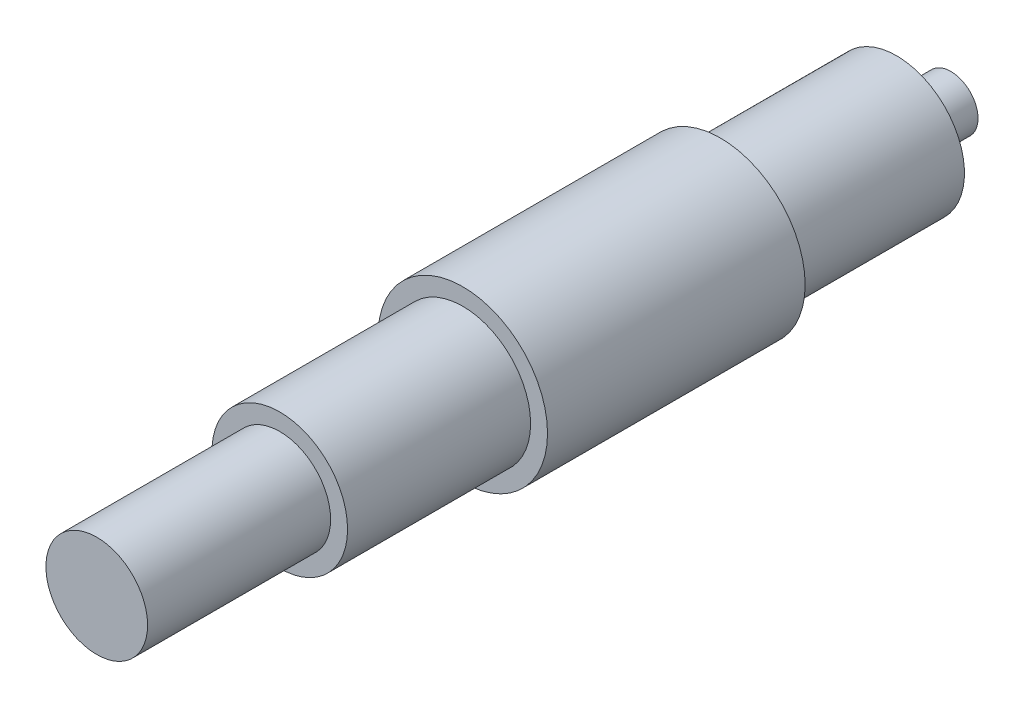
ISO-10303-21;
HEADER;
FILE_DESCRIPTION(('STEP AP214'),'2;1');
FILE_NAME('part.step','',(''),(''),'','','');
FILE_SCHEMA(('AUTOMOTIVE_DESIGN { 1 0 10303 214 1 1 1 1 }'));
ENDSEC;
DATA;
#1=APPLICATION_CONTEXT('core data for automotive mechanical design processes');
#2=APPLICATION_PROTOCOL_DEFINITION('international standard','automotive_design',2000,#1);
#3=PRODUCT_CONTEXT('',#1,'mechanical');
#4=PRODUCT('Part','Part','',(#3));
#5=PRODUCT_RELATED_PRODUCT_CATEGORY('part','',(#4));
#6=PRODUCT_DEFINITION_FORMATION('','',#4);
#7=PRODUCT_DEFINITION_CONTEXT('part definition',#1,'design');
#8=PRODUCT_DEFINITION('design','',#6,#7);
#9=PRODUCT_DEFINITION_SHAPE('','',#8);
#10=(LENGTH_UNIT() NAMED_UNIT(*) SI_UNIT(.MILLI.,.METRE.));
#11=(NAMED_UNIT(*) PLANE_ANGLE_UNIT() SI_UNIT($,.RADIAN.));
#12=(NAMED_UNIT(*) SI_UNIT($,.STERADIAN.) SOLID_ANGLE_UNIT());
#13=UNCERTAINTY_MEASURE_WITH_UNIT(LENGTH_MEASURE(1.E-05),#10,'distance_accuracy_value','');
#14=(GEOMETRIC_REPRESENTATION_CONTEXT(3) GLOBAL_UNCERTAINTY_ASSIGNED_CONTEXT((#13)) GLOBAL_UNIT_ASSIGNED_CONTEXT((#10,
#11,#12)) REPRESENTATION_CONTEXT('',''));
#15=CARTESIAN_POINT('',(0.,0.,0.));
#16=DIRECTION('',(0.,0.,1.));
#17=DIRECTION('',(1.,0.,0.));
#18=AXIS2_PLACEMENT_3D('',#15,#16,#17);
#19=CARTESIAN_POINT('',(0.,0.,8.));
#20=DIRECTION('',(0.,0.,-1.));
#21=DIRECTION('',(-1.,0.,0.));
#22=AXIS2_PLACEMENT_3D('',#19,#20,#21);
#23=CYLINDRICAL_SURFACE('',#22,4.);
#24=CARTESIAN_POINT('',(0.,0.,8.));
#25=DIRECTION('',(0.,0.,1.));
#26=DIRECTION('',(1.,0.,0.));
#27=AXIS2_PLACEMENT_3D('',#24,#25,#26);
#28=CIRCLE('',#27,4.);
#29=CARTESIAN_POINT('',(4.,0.,8.));
#30=VERTEX_POINT('',#29);
#31=EDGE_CURVE('E45',#30,#30,#28,.T.);
#32=ORIENTED_EDGE('',*,*,#31,.F.);
#33=EDGE_LOOP('',(#32));
#34=FACE_BOUND('',#33,.T.);
#35=CARTESIAN_POINT('',(0.,0.,0.));
#36=DIRECTION('',(0.,0.,1.));
#37=DIRECTION('',(1.,0.,0.));
#38=AXIS2_PLACEMENT_3D('',#35,#36,#37);
#39=CIRCLE('',#38,4.);
#40=CARTESIAN_POINT('',(4.,0.,0.));
#41=VERTEX_POINT('',#40);
#42=EDGE_CURVE('E41',#41,#41,#39,.T.);
#43=ORIENTED_EDGE('',*,*,#42,.T.);
#44=EDGE_LOOP('',(#43));
#45=FACE_BOUND('',#44,.T.);
#46=ADVANCED_FACE('F38',(#34,#45),#23,.T.);
#47=CARTESIAN_POINT('',(0.,0.,0.));
#48=DIRECTION('',(0.,0.,1.));
#49=DIRECTION('',(1.,0.,0.));
#50=AXIS2_PLACEMENT_3D('',#47,#48,#49);
#51=PLANE('',#50);
#52=ORIENTED_EDGE('',*,*,#42,.F.);
#53=EDGE_LOOP('',(#52));
#54=FACE_BOUND('',#53,.T.);
#55=ADVANCED_FACE('F81',(#54),#51,.F.);
#56=CARTESIAN_POINT('',(0.,0.,34.));
#57=DIRECTION('',(0.,0.,-1.));
#58=DIRECTION('',(-1.,0.,0.));
#59=AXIS2_PLACEMENT_3D('',#56,#57,#58);
#60=CYLINDRICAL_SURFACE('',#59,10.);
#61=CARTESIAN_POINT('',(0.,0.,34.));
#62=DIRECTION('',(0.,0.,1.));
#63=DIRECTION('',(1.,0.,0.));
#64=AXIS2_PLACEMENT_3D('',#61,#62,#63);
#65=CIRCLE('',#64,10.);
#66=CARTESIAN_POINT('',(-10.,0.,34.));
#67=VERTEX_POINT('',#66);
#68=EDGE_CURVE('E61',#67,#67,#65,.T.);
#69=CARTESIAN_POINT('',(0.,0.,8.));
#70=DIRECTION('',(0.,0.,1.));
#71=DIRECTION('',(1.,0.,0.));
#72=AXIS2_PLACEMENT_3D('',#69,#70,#71);
#73=CIRCLE('',#72,10.);
#74=CARTESIAN_POINT('',(-10.,0.,8.));
#75=VERTEX_POINT('',#74);
#76=EDGE_CURVE('E57',#75,#75,#73,.T.);
#77=CARTESIAN_POINT('',(-10.,0.,34.));
#78=CARTESIAN_POINT('',(-10.,0.,33.7291666666667));
#79=CARTESIAN_POINT('',(-10.,0.,33.4583333333333));
#80=CARTESIAN_POINT('',(-10.,0.,32.9166666666667));
#81=CARTESIAN_POINT('',(-10.,0.,32.6458333333333));
#82=CARTESIAN_POINT('',(-10.,0.,32.1041666666667));
#83=CARTESIAN_POINT('',(-10.,0.,31.8333333333333));
#84=CARTESIAN_POINT('',(-10.,0.,31.2916666666667));
#85=CARTESIAN_POINT('',(-10.,0.,31.0208333333333));
#86=CARTESIAN_POINT('',(-10.,0.,30.4791666666667));
#87=CARTESIAN_POINT('',(-10.,0.,30.2083333333333));
#88=CARTESIAN_POINT('',(-10.,0.,29.6666666666667));
#89=CARTESIAN_POINT('',(-10.,0.,29.3958333333333));
#90=CARTESIAN_POINT('',(-10.,0.,28.8541666666667));
#91=CARTESIAN_POINT('',(-10.,0.,28.5833333333333));
#92=CARTESIAN_POINT('',(-10.,0.,28.0416666666667));
#93=CARTESIAN_POINT('',(-10.,0.,27.7708333333333));
#94=CARTESIAN_POINT('',(-10.,0.,27.2291666666667));
#95=CARTESIAN_POINT('',(-10.,0.,26.9583333333333));
#96=CARTESIAN_POINT('',(-10.,0.,26.4166666666667));
#97=CARTESIAN_POINT('',(-10.,0.,26.1458333333333));
#98=CARTESIAN_POINT('',(-10.,0.,25.6041666666667));
#99=CARTESIAN_POINT('',(-10.,0.,25.3333333333333));
#100=CARTESIAN_POINT('',(-10.,0.,24.7916666666667));
#101=CARTESIAN_POINT('',(-10.,0.,24.5208333333333));
#102=CARTESIAN_POINT('',(-10.,0.,23.9791666666667));
#103=CARTESIAN_POINT('',(-10.,0.,23.7083333333333));
#104=CARTESIAN_POINT('',(-10.,0.,23.1666666666667));
#105=CARTESIAN_POINT('',(-10.,0.,22.8958333333333));
#106=CARTESIAN_POINT('',(-10.,0.,22.3541666666667));
#107=CARTESIAN_POINT('',(-10.,0.,22.0833333333333));
#108=CARTESIAN_POINT('',(-10.,0.,21.5416666666667));
#109=CARTESIAN_POINT('',(-10.,0.,21.2708333333333));
#110=CARTESIAN_POINT('',(-10.,0.,20.7291666666667));
#111=CARTESIAN_POINT('',(-10.,0.,20.4583333333333));
#112=CARTESIAN_POINT('',(-10.,0.,19.9166666666667));
#113=CARTESIAN_POINT('',(-10.,0.,19.6458333333333));
#114=CARTESIAN_POINT('',(-10.,0.,19.1041666666667));
#115=CARTESIAN_POINT('',(-10.,0.,18.8333333333333));
#116=CARTESIAN_POINT('',(-10.,0.,18.2916666666667));
#117=CARTESIAN_POINT('',(-10.,0.,18.0208333333333));
#118=CARTESIAN_POINT('',(-10.,0.,17.4791666666667));
#119=CARTESIAN_POINT('',(-10.,0.,17.2083333333333));
#120=CARTESIAN_POINT('',(-10.,0.,16.6666666666667));
#121=CARTESIAN_POINT('',(-10.,0.,16.3958333333333));
#122=CARTESIAN_POINT('',(-10.,0.,15.8541666666667));
#123=CARTESIAN_POINT('',(-10.,0.,15.5833333333333));
#124=CARTESIAN_POINT('',(-10.,0.,15.0416666666667));
#125=CARTESIAN_POINT('',(-10.,0.,14.7708333333333));
#126=CARTESIAN_POINT('',(-10.,0.,14.2291666666667));
#127=CARTESIAN_POINT('',(-10.,0.,13.9583333333333));
#128=CARTESIAN_POINT('',(-10.,0.,13.4166666666667));
#129=CARTESIAN_POINT('',(-10.,0.,13.1458333333333));
#130=CARTESIAN_POINT('',(-10.,0.,12.6041666666667));
#131=CARTESIAN_POINT('',(-10.,0.,12.3333333333333));
#132=CARTESIAN_POINT('',(-10.,0.,11.7916666666667));
#133=CARTESIAN_POINT('',(-10.,0.,11.5208333333333));
#134=CARTESIAN_POINT('',(-10.,0.,10.9791666666667));
#135=CARTESIAN_POINT('',(-10.,0.,10.7083333333333));
#136=CARTESIAN_POINT('',(-10.,0.,10.1666666666667));
#137=CARTESIAN_POINT('',(-10.,0.,9.89583333333333));
#138=CARTESIAN_POINT('',(-10.,0.,9.35416666666666));
#139=CARTESIAN_POINT('',(-10.,0.,9.08333333333333));
#140=CARTESIAN_POINT('',(-10.,0.,8.54166666666666));
#141=CARTESIAN_POINT('',(-10.,0.,8.27083333333333));
#142=CARTESIAN_POINT('',(-10.,0.,8.));
#143=B_SPLINE_CURVE_WITH_KNOTS('',3,(#77,#78,#79,#80,#81,#82,#83,#84,#85,#86,#87,#88,#89,#90,
#91,#92,#93,#94,#95,#96,#97,#98,#99,#100,#101,#102,#103,#104,#105,#106,#107,#108,#109,#110,#111,
#112,#113,#114,#115,#116,#117,#118,#119,#120,#121,#122,#123,#124,#125,#126,#127,#128,#129,#130,
#131,#132,#133,#134,#135,#136,#137,#138,#139,#140,#141,#142),.UNSPECIFIED.,.F.,.F.,(4,2,2,2,2,2,
2,2,2,2,2,2,2,2,2,2,2,2,2,2,2,2,2,2,2,2,2,2,2,2,2,2,4),(0.,0.812500000000001,1.625,2.4375,3.25,
4.0625,4.875,5.68750000000001,6.50000000000001,7.3125,8.125,8.93750000000001,9.75,10.5625,
11.375,12.1875,13.,13.8125,14.625,15.4375,16.25,17.0625,17.875,18.6875,19.5,20.3125,21.125,
21.9375,22.75,23.5625,24.375,25.1875,26.),.UNSPECIFIED.);
#144=EDGE_CURVE('BSEAM67',#67,#75,#143,.T.);
#145=ORIENTED_EDGE('',*,*,#68,.F.);
#146=ORIENTED_EDGE('',*,*,#76,.T.);
#147=ORIENTED_EDGE('',*,*,#144,.T.);
#148=ORIENTED_EDGE('',*,*,#144,.F.);
#149=EDGE_LOOP('',(#145,#147,#146,#148));
#150=FACE_BOUND('',#149,.T.);
#151=ADVANCED_FACE('F67',(#150),#60,.T.);
#152=CARTESIAN_POINT('',(0.,0.,8.));
#153=DIRECTION('',(0.,0.,1.));
#154=DIRECTION('',(1.,0.,0.));
#155=AXIS2_PLACEMENT_3D('',#152,#153,#154);
#156=PLANE('',#155);
#157=ORIENTED_EDGE('',*,*,#31,.T.);
#158=EDGE_LOOP('',(#157));
#159=FACE_BOUND('',#158,.T.);
#160=ORIENTED_EDGE('',*,*,#76,.F.);
#161=EDGE_LOOP('',(#160));
#162=FACE_BOUND('',#161,.T.);
#163=ADVANCED_FACE('F69',(#159,#162),#156,.F.);
#164=CARTESIAN_POINT('',(0.,0.,72.));
#165=DIRECTION('',(0.,0.,-1.));
#166=DIRECTION('',(-1.,0.,0.));
#167=AXIS2_PLACEMENT_3D('',#164,#165,#166);
#168=CYLINDRICAL_SURFACE('',#167,12.5);
#169=CARTESIAN_POINT('',(0.,0.,72.));
#170=DIRECTION('',(0.,0.,1.));
#171=DIRECTION('',(1.,0.,0.));
#172=AXIS2_PLACEMENT_3D('',#169,#170,#171);
#173=CIRCLE('',#172,12.5);
#174=CARTESIAN_POINT('',(12.5,0.,72.));
#175=VERTEX_POINT('',#174);
#176=EDGE_CURVE('E54',#175,#175,#173,.T.);
#177=ORIENTED_EDGE('',*,*,#176,.F.);
#178=EDGE_LOOP('',(#177));
#179=FACE_BOUND('',#178,.T.);
#180=CARTESIAN_POINT('',(0.,0.,34.));
#181=DIRECTION('',(0.,0.,1.));
#182=DIRECTION('',(1.,0.,0.));
#183=AXIS2_PLACEMENT_3D('',#180,#181,#182);
#184=CIRCLE('',#183,12.5);
#185=CARTESIAN_POINT('',(12.5,0.,34.));
#186=VERTEX_POINT('',#185);
#187=EDGE_CURVE('E58',#186,#186,#184,.T.);
#188=ORIENTED_EDGE('',*,*,#187,.T.);
#189=EDGE_LOOP('',(#188));
#190=FACE_BOUND('',#189,.T.);
#191=ADVANCED_FACE('F71',(#179,#190),#168,.T.);
#192=CARTESIAN_POINT('',(0.,0.,72.));
#193=DIRECTION('',(0.,0.,1.));
#194=DIRECTION('',(1.,0.,0.));
#195=AXIS2_PLACEMENT_3D('',#192,#193,#194);
#196=PLANE('',#195);
#197=CARTESIAN_POINT('',(0.,0.,72.));
#198=DIRECTION('',(0.,0.,1.));
#199=DIRECTION('',(1.,0.,0.));
#200=AXIS2_PLACEMENT_3D('',#197,#198,#199);
#201=CIRCLE('',#200,10.);
#202=CARTESIAN_POINT('',(10.,0.,72.));
#203=VERTEX_POINT('',#202);
#204=EDGE_CURVE('E10',#203,#203,#201,.T.);
#205=ORIENTED_EDGE('',*,*,#204,.F.);
#206=EDGE_LOOP('',(#205));
#207=FACE_BOUND('',#206,.T.);
#208=ORIENTED_EDGE('',*,*,#176,.T.);
#209=EDGE_LOOP('',(#208));
#210=FACE_BOUND('',#209,.T.);
#211=ADVANCED_FACE('F78',(#207,#210),#196,.T.);
#212=CARTESIAN_POINT('',(0.,0.,34.));
#213=DIRECTION('',(0.,0.,1.));
#214=DIRECTION('',(1.,0.,0.));
#215=AXIS2_PLACEMENT_3D('',#212,#213,#214);
#216=PLANE('',#215);
#217=ORIENTED_EDGE('',*,*,#68,.T.);
#218=EDGE_LOOP('',(#217));
#219=FACE_BOUND('',#218,.T.);
#220=ORIENTED_EDGE('',*,*,#187,.F.);
#221=EDGE_LOOP('',(#220));
#222=FACE_BOUND('',#221,.T.);
#223=ADVANCED_FACE('F120',(#219,#222),#216,.F.);
#224=CARTESIAN_POINT('',(0.,0.,92.));
#225=DIRECTION('',(0.,0.,-1.));
#226=DIRECTION('',(-1.,0.,0.));
#227=AXIS2_PLACEMENT_3D('',#224,#225,#226);
#228=CYLINDRICAL_SURFACE('',#227,10.);
#229=ORIENTED_EDGE('',*,*,#204,.T.);
#230=EDGE_LOOP('',(#229));
#231=FACE_BOUND('',#230,.T.);
#232=CARTESIAN_POINT('',(0.,0.,99.));
#233=DIRECTION('',(0.,0.,1.));
#234=DIRECTION('',(1.,0.,0.));
#235=AXIS2_PLACEMENT_3D('',#232,#233,#234);
#236=CIRCLE('',#235,10.);
#237=CARTESIAN_POINT('',(10.,0.,99.));
#238=VERTEX_POINT('',#237);
#239=EDGE_CURVE('E209',#238,#238,#236,.T.);
#240=ORIENTED_EDGE('',*,*,#239,.F.);
#241=EDGE_LOOP('',(#240));
#242=FACE_BOUND('',#241,.T.);
#243=ADVANCED_FACE('F125',(#231,#242),#228,.T.);
#244=CARTESIAN_POINT('',(0.,0.,99.));
#245=DIRECTION('',(0.,0.,1.));
#246=DIRECTION('',(1.,0.,0.));
#247=AXIS2_PLACEMENT_3D('',#244,#245,#246);
#248=PLANE('',#247);
#249=ORIENTED_EDGE('',*,*,#239,.T.);
#250=EDGE_LOOP('',(#249));
#251=FACE_BOUND('',#250,.T.);
#252=CARTESIAN_POINT('',(0.,0.,99.));
#253=DIRECTION('',(0.,0.,1.));
#254=DIRECTION('',(1.,0.,0.));
#255=AXIS2_PLACEMENT_3D('',#252,#253,#254);
#256=CIRCLE('',#255,7.5);
#257=CARTESIAN_POINT('',(7.5,0.,99.));
#258=VERTEX_POINT('',#257);
#259=EDGE_CURVE('E206',#258,#258,#256,.T.);
#260=ORIENTED_EDGE('',*,*,#259,.F.);
#261=EDGE_LOOP('',(#260));
#262=FACE_BOUND('',#261,.T.);
#263=ADVANCED_FACE('F148',(#251,#262),#248,.T.);
#264=CARTESIAN_POINT('',(0.,0.,126.));
#265=DIRECTION('',(0.,0.,1.));
#266=DIRECTION('',(1.,0.,0.));
#267=AXIS2_PLACEMENT_3D('',#264,#265,#266);
#268=PLANE('',#267);
#269=CARTESIAN_POINT('',(0.,0.,126.));
#270=DIRECTION('',(0.,0.,1.));
#271=DIRECTION('',(1.,0.,0.));
#272=AXIS2_PLACEMENT_3D('',#269,#270,#271);
#273=CIRCLE('',#272,7.5);
#274=CARTESIAN_POINT('',(7.5,0.,126.));
#275=VERTEX_POINT('',#274);
#276=EDGE_CURVE('E52',#275,#275,#273,.T.);
#277=ORIENTED_EDGE('',*,*,#276,.T.);
#278=EDGE_LOOP('',(#277));
#279=FACE_BOUND('',#278,.T.);
#280=ADVANCED_FACE('F142',(#279),#268,.T.);
#281=CARTESIAN_POINT('',(0.,0.,126.));
#282=DIRECTION('',(0.,0.,-1.));
#283=DIRECTION('',(-1.,0.,0.));
#284=AXIS2_PLACEMENT_3D('',#281,#282,#283);
#285=CYLINDRICAL_SURFACE('',#284,7.5);
#286=ORIENTED_EDGE('',*,*,#259,.T.);
#287=EDGE_LOOP('',(#286));
#288=FACE_BOUND('',#287,.T.);
#289=ORIENTED_EDGE('',*,*,#276,.F.);
#290=EDGE_LOOP('',(#289));
#291=FACE_BOUND('',#290,.T.);
#292=ADVANCED_FACE('F147',(#288,#291),#285,.T.);
#293=CLOSED_SHELL('',(#46,#55,#151,#163,#191,#211,#223,#243,#263,#280,#292));
#294=MANIFOLD_SOLID_BREP('B2',#293);
#295=ADVANCED_BREP_SHAPE_REPRESENTATION('',(#18,#294),#14);
#296=SHAPE_DEFINITION_REPRESENTATION(#9,#295);
ENDSEC;
END-ISO-10303-21;
